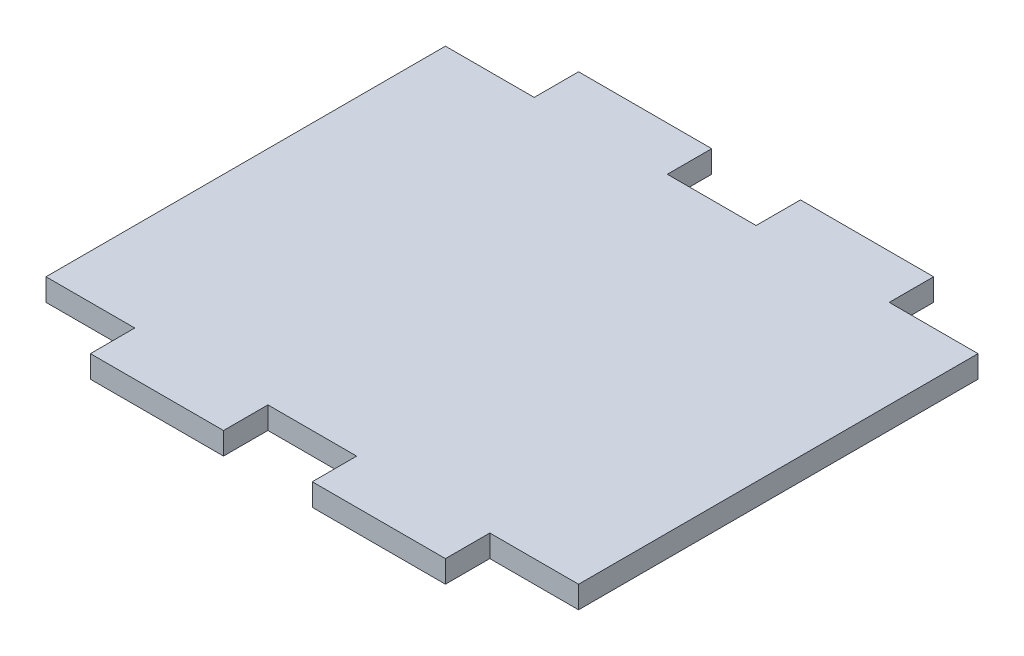
ISO-10303-21;
HEADER;
FILE_DESCRIPTION(('STEP AP214'),'2;1');
FILE_NAME('part.step','',(''),(''),'','','');
FILE_SCHEMA(('AUTOMOTIVE_DESIGN { 1 0 10303 214 1 1 1 1 }'));
ENDSEC;
DATA;
#1=APPLICATION_CONTEXT('core data for automotive mechanical design processes');
#2=APPLICATION_PROTOCOL_DEFINITION('international standard','automotive_design',2000,#1);
#3=PRODUCT_CONTEXT('',#1,'mechanical');
#4=PRODUCT('Part','Part','',(#3));
#5=PRODUCT_RELATED_PRODUCT_CATEGORY('part','',(#4));
#6=PRODUCT_DEFINITION_FORMATION('','',#4);
#7=PRODUCT_DEFINITION_CONTEXT('part definition',#1,'design');
#8=PRODUCT_DEFINITION('design','',#6,#7);
#9=PRODUCT_DEFINITION_SHAPE('','',#8);
#10=(LENGTH_UNIT() NAMED_UNIT(*) SI_UNIT(.MILLI.,.METRE.));
#11=(NAMED_UNIT(*) PLANE_ANGLE_UNIT() SI_UNIT($,.RADIAN.));
#12=(NAMED_UNIT(*) SI_UNIT($,.STERADIAN.) SOLID_ANGLE_UNIT());
#13=UNCERTAINTY_MEASURE_WITH_UNIT(LENGTH_MEASURE(1.E-05),#10,'distance_accuracy_value','');
#14=(GEOMETRIC_REPRESENTATION_CONTEXT(3) GLOBAL_UNCERTAINTY_ASSIGNED_CONTEXT((#13)) GLOBAL_UNIT_ASSIGNED_CONTEXT((#10,
#11,#12)) REPRESENTATION_CONTEXT('',''));
#15=CARTESIAN_POINT('',(0.,0.,0.));
#16=DIRECTION('',(0.,0.,1.));
#17=DIRECTION('',(1.,0.,0.));
#18=AXIS2_PLACEMENT_3D('',#15,#16,#17);
#19=CARTESIAN_POINT('',(0.,0.,-69.85));
#20=DIRECTION('',(0.,0.,1.));
#21=DIRECTION('',(1.,0.,0.));
#22=AXIS2_PLACEMENT_3D('',#19,#20,#21);
#23=PLANE('',#22);
#24=DIRECTION('',(1.,0.,0.));
#25=VECTOR('',#24,1.);
#26=CARTESIAN_POINT('',(-432.600339140843,194.772130659121,-69.85));
#27=LINE('',#26,#25);
#28=CARTESIAN_POINT('',(-388.150339140843,194.772130659121,-69.85));
#29=VERTEX_POINT('',#28);
#30=CARTESIAN_POINT('',(-369.100339140843,194.772130659121,-69.85));
#31=VERTEX_POINT('',#30);
#32=EDGE_CURVE('E206',#29,#31,#27,.T.);
#33=ORIENTED_EDGE('',*,*,#32,.F.);
#34=DIRECTION('',(0.,1.,0.));
#35=VECTOR('',#34,1.);
#36=CARTESIAN_POINT('',(-388.150339140843,194.772130659121,-69.85));
#37=LINE('',#36,#35);
#38=CARTESIAN_POINT('',(-388.150339140843,197.947130659121,-69.85));
#39=VERTEX_POINT('',#38);
#40=EDGE_CURVE('E289',#29,#39,#37,.T.);
#41=ORIENTED_EDGE('',*,*,#40,.T.);
#42=DIRECTION('',(-1.,0.,0.));
#43=VECTOR('',#42,1.);
#44=CARTESIAN_POINT('',(-356.400339140843,197.947130659121,-69.85));
#45=LINE('',#44,#43);
#46=CARTESIAN_POINT('',(-369.100339140843,197.947130659121,-69.85));
#47=VERTEX_POINT('',#46);
#48=EDGE_CURVE('E207',#47,#39,#45,.T.);
#49=ORIENTED_EDGE('',*,*,#48,.F.);
#50=DIRECTION('',(0.,1.,0.));
#51=VECTOR('',#50,1.);
#52=CARTESIAN_POINT('',(-369.100339140843,194.772130659121,-69.85));
#53=LINE('',#52,#51);
#54=EDGE_CURVE('E271',#31,#47,#53,.T.);
#55=ORIENTED_EDGE('',*,*,#54,.F.);
#56=EDGE_LOOP('',(#33,#41,#49,#55));
#57=FACE_BOUND('',#56,.T.);
#58=ADVANCED_FACE('F33',(#57),#23,.F.);
#59=CARTESIAN_POINT('',(0.,0.,0.));
#60=DIRECTION('',(0.,0.,1.));
#61=DIRECTION('',(1.,0.,0.));
#62=AXIS2_PLACEMENT_3D('',#59,#60,#61);
#63=PLANE('',#62);
#64=DIRECTION('',(0.,1.,0.));
#65=VECTOR('',#64,1.);
#66=CARTESIAN_POINT('',(-388.150339140843,194.772130659121,0.));
#67=LINE('',#66,#65);
#68=CARTESIAN_POINT('',(-388.150339140843,194.772130659121,0.));
#69=VERTEX_POINT('',#68);
#70=CARTESIAN_POINT('',(-388.150339140843,197.947130659121,0.));
#71=VERTEX_POINT('',#70);
#72=EDGE_CURVE('E225',#69,#71,#67,.T.);
#73=ORIENTED_EDGE('',*,*,#72,.F.);
#74=DIRECTION('',(1.,0.,0.));
#75=VECTOR('',#74,1.);
#76=CARTESIAN_POINT('',(-432.600339140843,194.772130659121,0.));
#77=LINE('',#76,#75);
#78=CARTESIAN_POINT('',(-369.100339140843,194.772130659121,0.));
#79=VERTEX_POINT('',#78);
#80=EDGE_CURVE('E200',#69,#79,#77,.T.);
#81=ORIENTED_EDGE('',*,*,#80,.T.);
#82=DIRECTION('',(0.,1.,0.));
#83=VECTOR('',#82,1.);
#84=CARTESIAN_POINT('',(-369.100339140843,194.772130659121,0.));
#85=LINE('',#84,#83);
#86=CARTESIAN_POINT('',(-369.100339140843,197.947130659121,0.));
#87=VERTEX_POINT('',#86);
#88=EDGE_CURVE('E216',#79,#87,#85,.T.);
#89=ORIENTED_EDGE('',*,*,#88,.T.);
#90=DIRECTION('',(-1.,0.,0.));
#91=VECTOR('',#90,1.);
#92=CARTESIAN_POINT('',(-356.400339140843,197.947130659121,0.));
#93=LINE('',#92,#91);
#94=EDGE_CURVE('E201',#87,#71,#93,.T.);
#95=ORIENTED_EDGE('',*,*,#94,.T.);
#96=EDGE_LOOP('',(#73,#81,#89,#95));
#97=FACE_BOUND('',#96,.T.);
#98=ADVANCED_FACE('F364',(#97),#63,.T.);
#99=CARTESIAN_POINT('',(-356.400339140843,194.772130659121,-69.85));
#100=DIRECTION('',(1.,0.,0.));
#101=DIRECTION('',(0.,0.,-1.));
#102=AXIS2_PLACEMENT_3D('',#99,#100,#101);
#103=PLANE('',#102);
#104=DIRECTION('',(0.,1.,0.));
#105=VECTOR('',#104,1.);
#106=CARTESIAN_POINT('',(-356.400339140843,194.772130659121,-63.5));
#107=LINE('',#106,#105);
#108=CARTESIAN_POINT('',(-356.400339140843,194.772130659121,-63.5));
#109=VERTEX_POINT('',#108);
#110=CARTESIAN_POINT('',(-356.400339140843,197.947130659121,-63.5));
#111=VERTEX_POINT('',#110);
#112=EDGE_CURVE('E268',#109,#111,#107,.T.);
#113=ORIENTED_EDGE('',*,*,#112,.T.);
#114=DIRECTION('',(0.,0.,1.));
#115=VECTOR('',#114,1.);
#116=CARTESIAN_POINT('',(-356.400339140843,197.947130659121,-69.85));
#117=LINE('',#116,#115);
#118=CARTESIAN_POINT('',(-356.400339140843,197.947130659121,-6.35000000000001));
#119=VERTEX_POINT('',#118);
#120=EDGE_CURVE('E37',#111,#119,#117,.T.);
#121=ORIENTED_EDGE('',*,*,#120,.T.);
#122=DIRECTION('',(0.,1.,0.));
#123=VECTOR('',#122,1.);
#124=CARTESIAN_POINT('',(-356.400339140843,194.772130659121,-6.35000000000001));
#125=LINE('',#124,#123);
#126=CARTESIAN_POINT('',(-356.400339140843,194.772130659121,-6.35000000000001));
#127=VERTEX_POINT('',#126);
#128=EDGE_CURVE('E210',#127,#119,#125,.T.);
#129=ORIENTED_EDGE('',*,*,#128,.F.);
#130=DIRECTION('',(0.,0.,1.));
#131=VECTOR('',#130,1.);
#132=CARTESIAN_POINT('',(-356.400339140843,194.772130659121,-69.85));
#133=LINE('',#132,#131);
#134=EDGE_CURVE('E11',#109,#127,#133,.T.);
#135=ORIENTED_EDGE('',*,*,#134,.F.);
#136=EDGE_LOOP('',(#113,#121,#129,#135));
#137=FACE_BOUND('',#136,.T.);
#138=ADVANCED_FACE('F35',(#137),#103,.T.);
#139=CARTESIAN_POINT('',(-432.600339140843,194.772130659121,-69.85));
#140=DIRECTION('',(0.,-1.,0.));
#141=DIRECTION('',(1.,0.,0.));
#142=AXIS2_PLACEMENT_3D('',#139,#140,#141);
#143=PLANE('',#142);
#144=DIRECTION('',(0.,0.,-1.));
#145=VECTOR('',#144,1.);
#146=CARTESIAN_POINT('',(-419.900339140843,194.772130659121,-69.85));
#147=LINE('',#146,#145);
#148=CARTESIAN_POINT('',(-419.900339140843,194.772130659121,-63.5));
#149=VERTEX_POINT('',#148);
#150=CARTESIAN_POINT('',(-419.900339140843,194.772130659121,-69.85));
#151=VERTEX_POINT('',#150);
#152=EDGE_CURVE('E181',#149,#151,#147,.T.);
#153=ORIENTED_EDGE('',*,*,#152,.T.);
#154=CARTESIAN_POINT('',(-400.850339140843,194.772130659121,-69.85));
#155=VERTEX_POINT('',#154);
#156=EDGE_CURVE('E58',#151,#155,#27,.T.);
#157=ORIENTED_EDGE('',*,*,#156,.T.);
#158=DIRECTION('',(0.,0.,1.));
#159=VECTOR('',#158,1.);
#160=CARTESIAN_POINT('',(-400.850339140843,194.772130659121,-63.5));
#161=LINE('',#160,#159);
#162=CARTESIAN_POINT('',(-400.850339140843,194.772130659121,-63.5));
#163=VERTEX_POINT('',#162);
#164=EDGE_CURVE('E310',#155,#163,#161,.T.);
#165=ORIENTED_EDGE('',*,*,#164,.T.);
#166=DIRECTION('',(1.,0.,0.));
#167=VECTOR('',#166,1.);
#168=CARTESIAN_POINT('',(-388.150339140843,194.772130659121,-63.5));
#169=LINE('',#168,#167);
#170=CARTESIAN_POINT('',(-388.150339140843,194.772130659121,-63.5));
#171=VERTEX_POINT('',#170);
#172=EDGE_CURVE('E293',#163,#171,#169,.T.);
#173=ORIENTED_EDGE('',*,*,#172,.T.);
#174=DIRECTION('',(0.,0.,-1.));
#175=VECTOR('',#174,1.);
#176=CARTESIAN_POINT('',(-388.150339140843,194.772130659121,-63.5));
#177=LINE('',#176,#175);
#178=EDGE_CURVE('E301',#171,#29,#177,.T.);
#179=ORIENTED_EDGE('',*,*,#178,.T.);
#180=ORIENTED_EDGE('',*,*,#32,.T.);
#181=DIRECTION('',(0.,0.,1.));
#182=VECTOR('',#181,1.);
#183=CARTESIAN_POINT('',(-369.100339140843,194.772130659121,-69.85));
#184=LINE('',#183,#182);
#185=CARTESIAN_POINT('',(-369.100339140843,194.772130659121,-63.5));
#186=VERTEX_POINT('',#185);
#187=EDGE_CURVE('E280',#31,#186,#184,.T.);
#188=ORIENTED_EDGE('',*,*,#187,.T.);
#189=DIRECTION('',(1.,0.,0.));
#190=VECTOR('',#189,1.);
#191=CARTESIAN_POINT('',(-356.400339140843,194.772130659121,-63.5));
#192=LINE('',#191,#190);
#193=EDGE_CURVE('E274',#186,#109,#192,.T.);
#194=ORIENTED_EDGE('',*,*,#193,.T.);
#195=ORIENTED_EDGE('',*,*,#134,.T.);
#196=DIRECTION('',(-1.,0.,0.));
#197=VECTOR('',#196,1.);
#198=CARTESIAN_POINT('',(-356.400339140843,194.772130659121,-6.35000000000001));
#199=LINE('',#198,#197);
#200=CARTESIAN_POINT('',(-369.100339140843,194.772130659121,-6.35000000000001));
#201=VERTEX_POINT('',#200);
#202=EDGE_CURVE('E221',#127,#201,#199,.T.);
#203=ORIENTED_EDGE('',*,*,#202,.T.);
#204=DIRECTION('',(0.,0.,1.));
#205=VECTOR('',#204,1.);
#206=CARTESIAN_POINT('',(-369.100339140843,194.772130659121,0.));
#207=LINE('',#206,#205);
#208=EDGE_CURVE('E214',#201,#79,#207,.T.);
#209=ORIENTED_EDGE('',*,*,#208,.T.);
#210=ORIENTED_EDGE('',*,*,#80,.F.);
#211=DIRECTION('',(0.,0.,-1.));
#212=VECTOR('',#211,1.);
#213=CARTESIAN_POINT('',(-388.150339140843,194.772130659121,0.));
#214=LINE('',#213,#212);
#215=CARTESIAN_POINT('',(-388.150339140843,194.772130659121,-6.35000000000001));
#216=VERTEX_POINT('',#215);
#217=EDGE_CURVE('E241',#69,#216,#214,.T.);
#218=ORIENTED_EDGE('',*,*,#217,.T.);
#219=DIRECTION('',(-1.,0.,0.));
#220=VECTOR('',#219,1.);
#221=CARTESIAN_POINT('',(-388.150339140843,194.772130659121,-6.35000000000001));
#222=LINE('',#221,#220);
#223=CARTESIAN_POINT('',(-400.850339140843,194.772130659121,-6.35000000000001));
#224=VERTEX_POINT('',#223);
#225=EDGE_CURVE('E251',#216,#224,#222,.T.);
#226=ORIENTED_EDGE('',*,*,#225,.T.);
#227=DIRECTION('',(0.,0.,1.));
#228=VECTOR('',#227,1.);
#229=CARTESIAN_POINT('',(-400.850339140843,194.772130659121,0.));
#230=LINE('',#229,#228);
#231=CARTESIAN_POINT('',(-400.850339140843,194.772130659121,0.));
#232=VERTEX_POINT('',#231);
#233=EDGE_CURVE('E233',#224,#232,#230,.T.);
#234=ORIENTED_EDGE('',*,*,#233,.T.);
#235=CARTESIAN_POINT('',(-419.900339140843,194.772130659121,0.));
#236=VERTEX_POINT('',#235);
#237=EDGE_CURVE('E197',#236,#232,#77,.T.);
#238=ORIENTED_EDGE('',*,*,#237,.F.);
#239=DIRECTION('',(0.,0.,-1.));
#240=VECTOR('',#239,1.);
#241=CARTESIAN_POINT('',(-419.900339140843,194.772130659121,0.));
#242=LINE('',#241,#240);
#243=CARTESIAN_POINT('',(-419.900339140843,194.772130659121,-6.35000000000001));
#244=VERTEX_POINT('',#243);
#245=EDGE_CURVE('E264',#236,#244,#242,.T.);
#246=ORIENTED_EDGE('',*,*,#245,.T.);
#247=DIRECTION('',(-1.,0.,0.));
#248=VECTOR('',#247,1.);
#249=CARTESIAN_POINT('',(-432.600339140843,194.772130659121,-6.35000000000001));
#250=LINE('',#249,#248);
#251=CARTESIAN_POINT('',(-432.600339140843,194.772130659121,-6.35000000000001));
#252=VERTEX_POINT('',#251);
#253=EDGE_CURVE('E194',#244,#252,#250,.T.);
#254=ORIENTED_EDGE('',*,*,#253,.T.);
#255=DIRECTION('',(0.,0.,1.));
#256=VECTOR('',#255,1.);
#257=CARTESIAN_POINT('',(-432.600339140843,194.772130659121,-69.85));
#258=LINE('',#257,#256);
#259=CARTESIAN_POINT('',(-432.600339140843,194.772130659121,-63.5));
#260=VERTEX_POINT('',#259);
#261=EDGE_CURVE('E42',#260,#252,#258,.T.);
#262=ORIENTED_EDGE('',*,*,#261,.F.);
#263=DIRECTION('',(1.,0.,0.));
#264=VECTOR('',#263,1.);
#265=CARTESIAN_POINT('',(-432.600339140843,194.772130659121,-63.5));
#266=LINE('',#265,#264);
#267=EDGE_CURVE('E172',#260,#149,#266,.T.);
#268=ORIENTED_EDGE('',*,*,#267,.T.);
#269=EDGE_LOOP('',(#153,#157,#165,#173,#179,#180,#188,#194,#195,#203,#209,#210,#218,#226,#234,
#238,#246,#254,#262,#268));
#270=FACE_BOUND('',#269,.T.);
#271=ADVANCED_FACE('F191',(#270),#143,.T.);
#272=CARTESIAN_POINT('',(-432.600339140843,197.947130659121,-69.85));
#273=DIRECTION('',(-1.,0.,0.));
#274=DIRECTION('',(0.,0.,1.));
#275=AXIS2_PLACEMENT_3D('',#272,#273,#274);
#276=PLANE('',#275);
#277=DIRECTION('',(0.,1.,0.));
#278=VECTOR('',#277,1.);
#279=CARTESIAN_POINT('',(-432.600339140843,194.772130659121,-63.5));
#280=LINE('',#279,#278);
#281=CARTESIAN_POINT('',(-432.600339140843,197.947130659121,-63.5));
#282=VERTEX_POINT('',#281);
#283=EDGE_CURVE('E176',#260,#282,#280,.T.);
#284=ORIENTED_EDGE('',*,*,#283,.F.);
#285=ORIENTED_EDGE('',*,*,#261,.T.);
#286=DIRECTION('',(0.,1.,0.));
#287=VECTOR('',#286,1.);
#288=CARTESIAN_POINT('',(-432.600339140843,194.772130659121,-6.35000000000001));
#289=LINE('',#288,#287);
#290=CARTESIAN_POINT('',(-432.600339140843,197.947130659121,-6.35000000000001));
#291=VERTEX_POINT('',#290);
#292=EDGE_CURVE('E248',#252,#291,#289,.T.);
#293=ORIENTED_EDGE('',*,*,#292,.T.);
#294=DIRECTION('',(0.,0.,1.));
#295=VECTOR('',#294,1.);
#296=CARTESIAN_POINT('',(-432.600339140843,197.947130659121,-69.85));
#297=LINE('',#296,#295);
#298=EDGE_CURVE('E188',#282,#291,#297,.T.);
#299=ORIENTED_EDGE('',*,*,#298,.F.);
#300=EDGE_LOOP('',(#284,#285,#293,#299));
#301=FACE_BOUND('',#300,.T.);
#302=ADVANCED_FACE('F185',(#301),#276,.T.);
#303=CARTESIAN_POINT('',(-356.400339140843,197.947130659121,-69.85));
#304=DIRECTION('',(0.,1.,0.));
#305=DIRECTION('',(-1.,0.,0.));
#306=AXIS2_PLACEMENT_3D('',#303,#304,#305);
#307=PLANE('',#306);
#308=DIRECTION('',(0.,0.,-1.));
#309=VECTOR('',#308,1.);
#310=CARTESIAN_POINT('',(-419.900339140843,197.947130659121,-69.85));
#311=LINE('',#310,#309);
#312=CARTESIAN_POINT('',(-419.900339140843,197.947130659121,-63.5));
#313=VERTEX_POINT('',#312);
#314=CARTESIAN_POINT('',(-419.900339140843,197.947130659121,-69.85));
#315=VERTEX_POINT('',#314);
#316=EDGE_CURVE('E50',#313,#315,#311,.T.);
#317=ORIENTED_EDGE('',*,*,#316,.F.);
#318=DIRECTION('',(1.,0.,0.));
#319=VECTOR('',#318,1.);
#320=CARTESIAN_POINT('',(-432.600339140843,197.947130659121,-63.5));
#321=LINE('',#320,#319);
#322=EDGE_CURVE('E317',#282,#313,#321,.T.);
#323=ORIENTED_EDGE('',*,*,#322,.F.);
#324=ORIENTED_EDGE('',*,*,#298,.T.);
#325=DIRECTION('',(-1.,0.,0.));
#326=VECTOR('',#325,1.);
#327=CARTESIAN_POINT('',(-432.600339140843,197.947130659121,-6.35000000000001));
#328=LINE('',#327,#326);
#329=CARTESIAN_POINT('',(-419.900339140843,197.947130659121,-6.35000000000001));
#330=VERTEX_POINT('',#329);
#331=EDGE_CURVE('E261',#330,#291,#328,.T.);
#332=ORIENTED_EDGE('',*,*,#331,.F.);
#333=DIRECTION('',(0.,0.,-1.));
#334=VECTOR('',#333,1.);
#335=CARTESIAN_POINT('',(-419.900339140843,197.947130659121,0.));
#336=LINE('',#335,#334);
#337=CARTESIAN_POINT('',(-419.900339140843,197.947130659121,0.));
#338=VERTEX_POINT('',#337);
#339=EDGE_CURVE('E265',#338,#330,#336,.T.);
#340=ORIENTED_EDGE('',*,*,#339,.F.);
#341=CARTESIAN_POINT('',(-400.850339140843,197.947130659121,0.));
#342=VERTEX_POINT('',#341);
#343=EDGE_CURVE('E204',#342,#338,#93,.T.);
#344=ORIENTED_EDGE('',*,*,#343,.F.);
#345=DIRECTION('',(0.,0.,1.));
#346=VECTOR('',#345,1.);
#347=CARTESIAN_POINT('',(-400.850339140843,197.947130659121,0.));
#348=LINE('',#347,#346);
#349=CARTESIAN_POINT('',(-400.850339140843,197.947130659121,-6.35000000000001));
#350=VERTEX_POINT('',#349);
#351=EDGE_CURVE('E239',#350,#342,#348,.T.);
#352=ORIENTED_EDGE('',*,*,#351,.F.);
#353=DIRECTION('',(-1.,0.,0.));
#354=VECTOR('',#353,1.);
#355=CARTESIAN_POINT('',(-388.150339140843,197.947130659121,-6.35000000000001));
#356=LINE('',#355,#354);
#357=CARTESIAN_POINT('',(-388.150339140843,197.947130659121,-6.35000000000001));
#358=VERTEX_POINT('',#357);
#359=EDGE_CURVE('E242',#358,#350,#356,.T.);
#360=ORIENTED_EDGE('',*,*,#359,.F.);
#361=DIRECTION('',(0.,0.,-1.));
#362=VECTOR('',#361,1.);
#363=CARTESIAN_POINT('',(-388.150339140843,197.947130659121,0.));
#364=LINE('',#363,#362);
#365=EDGE_CURVE('E245',#71,#358,#364,.T.);
#366=ORIENTED_EDGE('',*,*,#365,.F.);
#367=ORIENTED_EDGE('',*,*,#94,.F.);
#368=DIRECTION('',(0.,0.,1.));
#369=VECTOR('',#368,1.);
#370=CARTESIAN_POINT('',(-369.100339140843,197.947130659121,0.));
#371=LINE('',#370,#369);
#372=CARTESIAN_POINT('',(-369.100339140843,197.947130659121,-6.35000000000001));
#373=VERTEX_POINT('',#372);
#374=EDGE_CURVE('E219',#373,#87,#371,.T.);
#375=ORIENTED_EDGE('',*,*,#374,.F.);
#376=DIRECTION('',(-1.,0.,0.));
#377=VECTOR('',#376,1.);
#378=CARTESIAN_POINT('',(-356.400339140843,197.947130659121,-6.35000000000001));
#379=LINE('',#378,#377);
#380=EDGE_CURVE('E222',#119,#373,#379,.T.);
#381=ORIENTED_EDGE('',*,*,#380,.F.);
#382=ORIENTED_EDGE('',*,*,#120,.F.);
#383=DIRECTION('',(1.,0.,0.));
#384=VECTOR('',#383,1.);
#385=CARTESIAN_POINT('',(-356.400339140843,197.947130659121,-63.5));
#386=LINE('',#385,#384);
#387=CARTESIAN_POINT('',(-369.100339140843,197.947130659121,-63.5));
#388=VERTEX_POINT('',#387);
#389=EDGE_CURVE('E278',#388,#111,#386,.T.);
#390=ORIENTED_EDGE('',*,*,#389,.F.);
#391=DIRECTION('',(0.,0.,1.));
#392=VECTOR('',#391,1.);
#393=CARTESIAN_POINT('',(-369.100339140843,197.947130659121,-69.85));
#394=LINE('',#393,#392);
#395=EDGE_CURVE('E281',#47,#388,#394,.T.);
#396=ORIENTED_EDGE('',*,*,#395,.F.);
#397=ORIENTED_EDGE('',*,*,#48,.T.);
#398=DIRECTION('',(0.,0.,-1.));
#399=VECTOR('',#398,1.);
#400=CARTESIAN_POINT('',(-388.150339140843,197.947130659121,-63.5));
#401=LINE('',#400,#399);
#402=CARTESIAN_POINT('',(-388.150339140843,197.947130659121,-63.5));
#403=VERTEX_POINT('',#402);
#404=EDGE_CURVE('E305',#403,#39,#401,.T.);
#405=ORIENTED_EDGE('',*,*,#404,.F.);
#406=DIRECTION('',(1.,0.,0.));
#407=VECTOR('',#406,1.);
#408=CARTESIAN_POINT('',(-388.150339140843,197.947130659121,-63.5));
#409=LINE('',#408,#407);
#410=CARTESIAN_POINT('',(-400.850339140843,197.947130659121,-63.5));
#411=VERTEX_POINT('',#410);
#412=EDGE_CURVE('E298',#411,#403,#409,.T.);
#413=ORIENTED_EDGE('',*,*,#412,.F.);
#414=DIRECTION('',(0.,0.,1.));
#415=VECTOR('',#414,1.);
#416=CARTESIAN_POINT('',(-400.850339140843,197.947130659121,-63.5));
#417=LINE('',#416,#415);
#418=CARTESIAN_POINT('',(-400.850339140843,197.947130659121,-69.85));
#419=VERTEX_POINT('',#418);
#420=EDGE_CURVE('E302',#419,#411,#417,.T.);
#421=ORIENTED_EDGE('',*,*,#420,.F.);
#422=EDGE_CURVE('E199',#419,#315,#45,.T.);
#423=ORIENTED_EDGE('',*,*,#422,.T.);
#424=EDGE_LOOP('',(#317,#323,#324,#332,#340,#344,#352,#360,#366,#367,#375,#381,#382,#390,#396,
#397,#405,#413,#421,#423));
#425=FACE_BOUND('',#424,.T.);
#426=ADVANCED_FACE('F329',(#425),#307,.T.);
#427=ORIENTED_EDGE('',*,*,#156,.F.);
#428=DIRECTION('',(0.,1.,0.));
#429=VECTOR('',#428,1.);
#430=CARTESIAN_POINT('',(-419.900339140843,194.772130659121,-69.85));
#431=LINE('',#430,#429);
#432=EDGE_CURVE('E307',#151,#315,#431,.T.);
#433=ORIENTED_EDGE('',*,*,#432,.T.);
#434=ORIENTED_EDGE('',*,*,#422,.F.);
#435=DIRECTION('',(0.,1.,0.));
#436=VECTOR('',#435,1.);
#437=CARTESIAN_POINT('',(-400.850339140843,194.772130659121,-69.85));
#438=LINE('',#437,#436);
#439=EDGE_CURVE('E292',#155,#419,#438,.T.);
#440=ORIENTED_EDGE('',*,*,#439,.F.);
#441=EDGE_LOOP('',(#427,#433,#434,#440));
#442=FACE_BOUND('',#441,.T.);
#443=ADVANCED_FACE('F321',(#442),#23,.F.);
#444=DIRECTION('',(0.,1.,0.));
#445=VECTOR('',#444,1.);
#446=CARTESIAN_POINT('',(-419.900339140843,194.772130659121,0.));
#447=LINE('',#446,#445);
#448=EDGE_CURVE('E256',#236,#338,#447,.T.);
#449=ORIENTED_EDGE('',*,*,#448,.F.);
#450=ORIENTED_EDGE('',*,*,#237,.T.);
#451=DIRECTION('',(0.,1.,0.));
#452=VECTOR('',#451,1.);
#453=CARTESIAN_POINT('',(-400.850339140843,194.772130659121,0.));
#454=LINE('',#453,#452);
#455=EDGE_CURVE('E235',#232,#342,#454,.T.);
#456=ORIENTED_EDGE('',*,*,#455,.T.);
#457=ORIENTED_EDGE('',*,*,#343,.T.);
#458=EDGE_LOOP('',(#449,#450,#456,#457));
#459=FACE_BOUND('',#458,.T.);
#460=ADVANCED_FACE('F383',(#459),#63,.T.);
#461=CARTESIAN_POINT('',(-369.100339140843,194.772130659121,0.));
#462=DIRECTION('',(-1.,0.,0.));
#463=DIRECTION('',(0.,-1.,0.));
#464=AXIS2_PLACEMENT_3D('',#461,#462,#463);
#465=PLANE('',#464);
#466=ORIENTED_EDGE('',*,*,#374,.T.);
#467=ORIENTED_EDGE('',*,*,#88,.F.);
#468=ORIENTED_EDGE('',*,*,#208,.F.);
#469=DIRECTION('',(0.,1.,0.));
#470=VECTOR('',#469,1.);
#471=CARTESIAN_POINT('',(-369.100339140843,194.772130659121,-6.35000000000001));
#472=LINE('',#471,#470);
#473=EDGE_CURVE('E213',#201,#373,#472,.T.);
#474=ORIENTED_EDGE('',*,*,#473,.T.);
#475=EDGE_LOOP('',(#466,#467,#468,#474));
#476=FACE_BOUND('',#475,.T.);
#477=ADVANCED_FACE('F360',(#476),#465,.F.);
#478=CARTESIAN_POINT('',(-356.400339140843,194.772130659121,-6.35000000000001));
#479=DIRECTION('',(0.,0.,-1.));
#480=DIRECTION('',(-1.,0.,0.));
#481=AXIS2_PLACEMENT_3D('',#478,#479,#480);
#482=PLANE('',#481);
#483=ORIENTED_EDGE('',*,*,#380,.T.);
#484=ORIENTED_EDGE('',*,*,#473,.F.);
#485=ORIENTED_EDGE('',*,*,#202,.F.);
#486=ORIENTED_EDGE('',*,*,#128,.T.);
#487=EDGE_LOOP('',(#483,#484,#485,#486));
#488=FACE_BOUND('',#487,.T.);
#489=ADVANCED_FACE('F355',(#488),#482,.F.);
#490=CARTESIAN_POINT('',(-388.150339140843,194.772130659121,0.));
#491=DIRECTION('',(1.,0.,0.));
#492=DIRECTION('',(0.,1.,0.));
#493=AXIS2_PLACEMENT_3D('',#490,#491,#492);
#494=PLANE('',#493);
#495=ORIENTED_EDGE('',*,*,#365,.T.);
#496=DIRECTION('',(0.,1.,0.));
#497=VECTOR('',#496,1.);
#498=CARTESIAN_POINT('',(-388.150339140843,194.772130659121,-6.35000000000001));
#499=LINE('',#498,#497);
#500=EDGE_CURVE('E230',#216,#358,#499,.T.);
#501=ORIENTED_EDGE('',*,*,#500,.F.);
#502=ORIENTED_EDGE('',*,*,#217,.F.);
#503=ORIENTED_EDGE('',*,*,#72,.T.);
#504=EDGE_LOOP('',(#495,#501,#502,#503));
#505=FACE_BOUND('',#504,.T.);
#506=ADVANCED_FACE('F368',(#505),#494,.F.);
#507=CARTESIAN_POINT('',(-400.850339140843,194.772130659121,0.));
#508=DIRECTION('',(-1.,0.,0.));
#509=DIRECTION('',(0.,-1.,0.));
#510=AXIS2_PLACEMENT_3D('',#507,#508,#509);
#511=PLANE('',#510);
#512=ORIENTED_EDGE('',*,*,#351,.T.);
#513=ORIENTED_EDGE('',*,*,#455,.F.);
#514=ORIENTED_EDGE('',*,*,#233,.F.);
#515=DIRECTION('',(0.,1.,0.));
#516=VECTOR('',#515,1.);
#517=CARTESIAN_POINT('',(-400.850339140843,194.772130659121,-6.35000000000001));
#518=LINE('',#517,#516);
#519=EDGE_CURVE('E232',#224,#350,#518,.T.);
#520=ORIENTED_EDGE('',*,*,#519,.T.);
#521=EDGE_LOOP('',(#512,#513,#514,#520));
#522=FACE_BOUND('',#521,.T.);
#523=ADVANCED_FACE('F379',(#522),#511,.F.);
#524=CARTESIAN_POINT('',(-388.150339140843,194.772130659121,-6.35000000000001));
#525=DIRECTION('',(0.,0.,-1.));
#526=DIRECTION('',(-1.,0.,0.));
#527=AXIS2_PLACEMENT_3D('',#524,#525,#526);
#528=PLANE('',#527);
#529=ORIENTED_EDGE('',*,*,#359,.T.);
#530=ORIENTED_EDGE('',*,*,#519,.F.);
#531=ORIENTED_EDGE('',*,*,#225,.F.);
#532=ORIENTED_EDGE('',*,*,#500,.T.);
#533=EDGE_LOOP('',(#529,#530,#531,#532));
#534=FACE_BOUND('',#533,.T.);
#535=ADVANCED_FACE('F373',(#534),#528,.F.);
#536=CARTESIAN_POINT('',(-432.600339140843,194.772130659121,-6.35000000000001));
#537=DIRECTION('',(0.,0.,-1.));
#538=DIRECTION('',(-1.,0.,0.));
#539=AXIS2_PLACEMENT_3D('',#536,#537,#538);
#540=PLANE('',#539);
#541=ORIENTED_EDGE('',*,*,#331,.T.);
#542=ORIENTED_EDGE('',*,*,#292,.F.);
#543=ORIENTED_EDGE('',*,*,#253,.F.);
#544=DIRECTION('',(0.,1.,0.));
#545=VECTOR('',#544,1.);
#546=CARTESIAN_POINT('',(-419.900339140843,194.772130659121,-6.35000000000001));
#547=LINE('',#546,#545);
#548=EDGE_CURVE('E258',#244,#330,#547,.T.);
#549=ORIENTED_EDGE('',*,*,#548,.T.);
#550=EDGE_LOOP('',(#541,#542,#543,#549));
#551=FACE_BOUND('',#550,.T.);
#552=ADVANCED_FACE('F389',(#551),#540,.F.);
#553=CARTESIAN_POINT('',(-419.900339140843,194.772130659121,0.));
#554=DIRECTION('',(1.,0.,0.));
#555=DIRECTION('',(0.,1.,0.));
#556=AXIS2_PLACEMENT_3D('',#553,#554,#555);
#557=PLANE('',#556);
#558=ORIENTED_EDGE('',*,*,#339,.T.);
#559=ORIENTED_EDGE('',*,*,#548,.F.);
#560=ORIENTED_EDGE('',*,*,#245,.F.);
#561=ORIENTED_EDGE('',*,*,#448,.T.);
#562=EDGE_LOOP('',(#558,#559,#560,#561));
#563=FACE_BOUND('',#562,.T.);
#564=ADVANCED_FACE('F387',(#563),#557,.F.);
#565=CARTESIAN_POINT('',(-356.400339140843,194.772130659121,-63.5));
#566=DIRECTION('',(0.,0.,1.));
#567=DIRECTION('',(1.,0.,0.));
#568=AXIS2_PLACEMENT_3D('',#565,#566,#567);
#569=PLANE('',#568);
#570=ORIENTED_EDGE('',*,*,#389,.T.);
#571=ORIENTED_EDGE('',*,*,#112,.F.);
#572=ORIENTED_EDGE('',*,*,#193,.F.);
#573=DIRECTION('',(0.,1.,0.));
#574=VECTOR('',#573,1.);
#575=CARTESIAN_POINT('',(-369.100339140843,194.772130659121,-63.5));
#576=LINE('',#575,#574);
#577=EDGE_CURVE('E273',#186,#388,#576,.T.);
#578=ORIENTED_EDGE('',*,*,#577,.T.);
#579=EDGE_LOOP('',(#570,#571,#572,#578));
#580=FACE_BOUND('',#579,.T.);
#581=ADVANCED_FACE('F348',(#580),#569,.F.);
#582=CARTESIAN_POINT('',(-369.100339140843,194.772130659121,-69.85));
#583=DIRECTION('',(-1.,0.,0.));
#584=DIRECTION('',(0.,-1.,0.));
#585=AXIS2_PLACEMENT_3D('',#582,#583,#584);
#586=PLANE('',#585);
#587=ORIENTED_EDGE('',*,*,#395,.T.);
#588=ORIENTED_EDGE('',*,*,#577,.F.);
#589=ORIENTED_EDGE('',*,*,#187,.F.);
#590=ORIENTED_EDGE('',*,*,#54,.T.);
#591=EDGE_LOOP('',(#587,#588,#589,#590));
#592=FACE_BOUND('',#591,.T.);
#593=ADVANCED_FACE('F343',(#592),#586,.F.);
#594=CARTESIAN_POINT('',(-388.150339140843,194.772130659121,-63.5));
#595=DIRECTION('',(1.,0.,0.));
#596=DIRECTION('',(0.,1.,0.));
#597=AXIS2_PLACEMENT_3D('',#594,#595,#596);
#598=PLANE('',#597);
#599=ORIENTED_EDGE('',*,*,#404,.T.);
#600=ORIENTED_EDGE('',*,*,#40,.F.);
#601=ORIENTED_EDGE('',*,*,#178,.F.);
#602=DIRECTION('',(0.,1.,0.));
#603=VECTOR('',#602,1.);
#604=CARTESIAN_POINT('',(-388.150339140843,194.772130659121,-63.5));
#605=LINE('',#604,#603);
#606=EDGE_CURVE('E284',#171,#403,#605,.T.);
#607=ORIENTED_EDGE('',*,*,#606,.T.);
#608=EDGE_LOOP('',(#599,#600,#601,#607));
#609=FACE_BOUND('',#608,.T.);
#610=ADVANCED_FACE('F490',(#609),#598,.F.);
#611=CARTESIAN_POINT('',(-388.150339140843,194.772130659121,-63.5));
#612=DIRECTION('',(0.,0.,1.));
#613=DIRECTION('',(1.,0.,0.));
#614=AXIS2_PLACEMENT_3D('',#611,#612,#613);
#615=PLANE('',#614);
#616=ORIENTED_EDGE('',*,*,#412,.T.);
#617=ORIENTED_EDGE('',*,*,#606,.F.);
#618=ORIENTED_EDGE('',*,*,#172,.F.);
#619=DIRECTION('',(0.,1.,0.));
#620=VECTOR('',#619,1.);
#621=CARTESIAN_POINT('',(-400.850339140843,194.772130659121,-63.5));
#622=LINE('',#621,#620);
#623=EDGE_CURVE('E295',#163,#411,#622,.T.);
#624=ORIENTED_EDGE('',*,*,#623,.T.);
#625=EDGE_LOOP('',(#616,#617,#618,#624));
#626=FACE_BOUND('',#625,.T.);
#627=ADVANCED_FACE('F332',(#626),#615,.F.);
#628=CARTESIAN_POINT('',(-400.850339140843,194.772130659121,-63.5));
#629=DIRECTION('',(-1.,0.,0.));
#630=DIRECTION('',(0.,-1.,0.));
#631=AXIS2_PLACEMENT_3D('',#628,#629,#630);
#632=PLANE('',#631);
#633=ORIENTED_EDGE('',*,*,#420,.T.);
#634=ORIENTED_EDGE('',*,*,#623,.F.);
#635=ORIENTED_EDGE('',*,*,#164,.F.);
#636=ORIENTED_EDGE('',*,*,#439,.T.);
#637=EDGE_LOOP('',(#633,#634,#635,#636));
#638=FACE_BOUND('',#637,.T.);
#639=ADVANCED_FACE('F326',(#638),#632,.F.);
#640=CARTESIAN_POINT('',(-419.900339140843,194.772130659121,-69.85));
#641=DIRECTION('',(1.,0.,0.));
#642=DIRECTION('',(0.,1.,0.));
#643=AXIS2_PLACEMENT_3D('',#640,#641,#642);
#644=PLANE('',#643);
#645=ORIENTED_EDGE('',*,*,#316,.T.);
#646=ORIENTED_EDGE('',*,*,#432,.F.);
#647=ORIENTED_EDGE('',*,*,#152,.F.);
#648=DIRECTION('',(0.,1.,0.));
#649=VECTOR('',#648,1.);
#650=CARTESIAN_POINT('',(-419.900339140843,194.772130659121,-63.5));
#651=LINE('',#650,#649);
#652=EDGE_CURVE('E178',#149,#313,#651,.T.);
#653=ORIENTED_EDGE('',*,*,#652,.T.);
#654=EDGE_LOOP('',(#645,#646,#647,#653));
#655=FACE_BOUND('',#654,.T.);
#656=ADVANCED_FACE('F511',(#655),#644,.F.);
#657=CARTESIAN_POINT('',(-432.600339140843,194.772130659121,-63.5));
#658=DIRECTION('',(0.,0.,1.));
#659=DIRECTION('',(1.,0.,0.));
#660=AXIS2_PLACEMENT_3D('',#657,#658,#659);
#661=PLANE('',#660);
#662=ORIENTED_EDGE('',*,*,#322,.T.);
#663=ORIENTED_EDGE('',*,*,#652,.F.);
#664=ORIENTED_EDGE('',*,*,#267,.F.);
#665=ORIENTED_EDGE('',*,*,#283,.T.);
#666=EDGE_LOOP('',(#662,#663,#664,#665));
#667=FACE_BOUND('',#666,.T.);
#668=ADVANCED_FACE('F175',(#667),#661,.F.);
#669=CLOSED_SHELL('',(#58,#98,#138,#271,#302,#426,#443,#460,#477,#489,#506,#523,#535,#552,#564,
#581,#593,#610,#627,#639,#656,#668));
#670=MANIFOLD_SOLID_BREP('B2',#669);
#671=ADVANCED_BREP_SHAPE_REPRESENTATION('',(#18,#670),#14);
#672=SHAPE_DEFINITION_REPRESENTATION(#9,#671);
ENDSEC;
END-ISO-10303-21;
